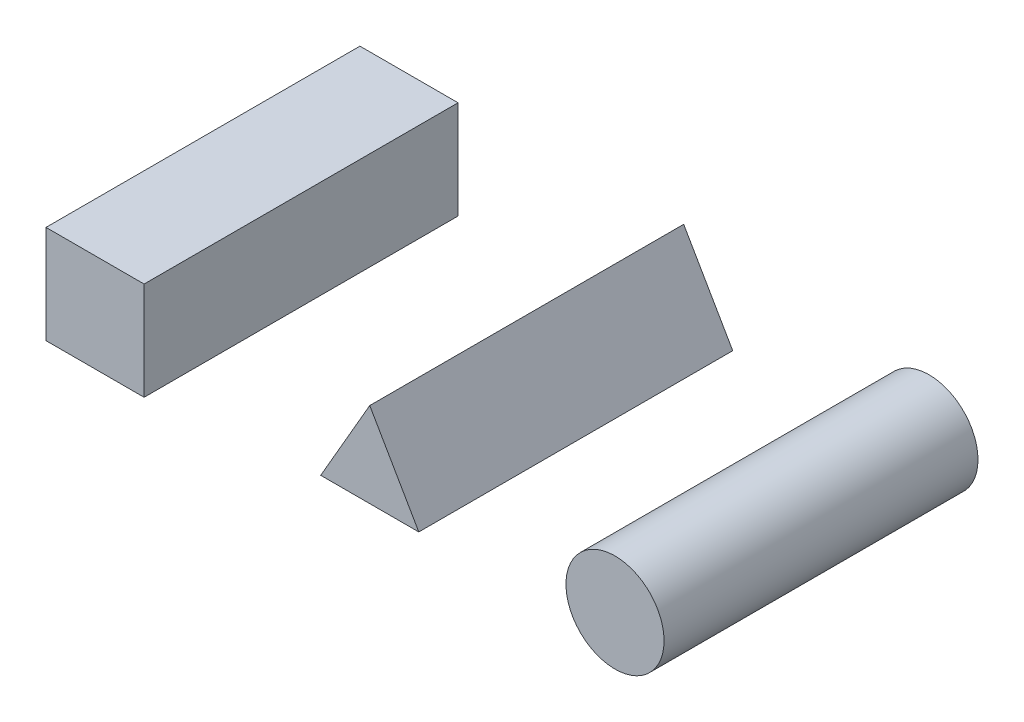
ISO-10303-21;
HEADER;
FILE_DESCRIPTION(('STEP AP214'),'2;1');
FILE_NAME('part.step','',(''),(''),'','','');
FILE_SCHEMA(('AUTOMOTIVE_DESIGN { 1 0 10303 214 1 1 1 1 }'));
ENDSEC;
DATA;
#1=APPLICATION_CONTEXT('core data for automotive mechanical design processes');
#2=APPLICATION_PROTOCOL_DEFINITION('international standard','automotive_design',2000,#1);
#3=PRODUCT_CONTEXT('',#1,'mechanical');
#4=PRODUCT('Part','Part','',(#3));
#5=PRODUCT_RELATED_PRODUCT_CATEGORY('part','',(#4));
#6=PRODUCT_DEFINITION_FORMATION('','',#4);
#7=PRODUCT_DEFINITION_CONTEXT('part definition',#1,'design');
#8=PRODUCT_DEFINITION('design','',#6,#7);
#9=PRODUCT_DEFINITION_SHAPE('','',#8);
#10=(LENGTH_UNIT() NAMED_UNIT(*) SI_UNIT(.MILLI.,.METRE.));
#11=(NAMED_UNIT(*) PLANE_ANGLE_UNIT() SI_UNIT($,.RADIAN.));
#12=(NAMED_UNIT(*) SI_UNIT($,.STERADIAN.) SOLID_ANGLE_UNIT());
#13=UNCERTAINTY_MEASURE_WITH_UNIT(LENGTH_MEASURE(1.E-05),#10,'distance_accuracy_value','');
#14=(GEOMETRIC_REPRESENTATION_CONTEXT(3) GLOBAL_UNCERTAINTY_ASSIGNED_CONTEXT((#13)) GLOBAL_UNIT_ASSIGNED_CONTEXT((#10,
#11,#12)) REPRESENTATION_CONTEXT('',''));
#15=CARTESIAN_POINT('',(0.,0.,0.));
#16=DIRECTION('',(0.,0.,1.));
#17=DIRECTION('',(1.,0.,0.));
#18=AXIS2_PLACEMENT_3D('',#15,#16,#17);
#19=CARTESIAN_POINT('',(62.5,-1.72152649380189E-13,80.));
#20=DIRECTION('',(0.,0.,-1.));
#21=DIRECTION('',(-1.,0.,0.));
#22=AXIS2_PLACEMENT_3D('',#19,#20,#21);
#23=CYLINDRICAL_SURFACE('',#22,12.5);
#24=CARTESIAN_POINT('',(62.5,-1.72152649380189E-13,80.));
#25=DIRECTION('',(0.,0.,1.));
#26=DIRECTION('',(1.,0.,0.));
#27=AXIS2_PLACEMENT_3D('',#24,#25,#26);
#28=CIRCLE('',#27,12.5);
#29=CARTESIAN_POINT('',(75.,-1.72152649380189E-13,80.));
#30=VERTEX_POINT('',#29);
#31=EDGE_CURVE('E11',#30,#30,#28,.T.);
#32=ORIENTED_EDGE('',*,*,#31,.F.);
#33=EDGE_LOOP('',(#32));
#34=FACE_BOUND('',#33,.T.);
#35=CARTESIAN_POINT('',(62.5,-1.72152649380189E-13,0.));
#36=DIRECTION('',(0.,0.,1.));
#37=DIRECTION('',(1.,0.,0.));
#38=AXIS2_PLACEMENT_3D('',#35,#36,#37);
#39=CIRCLE('',#38,12.5);
#40=CARTESIAN_POINT('',(75.,-1.72152649380189E-13,0.));
#41=VERTEX_POINT('',#40);
#42=EDGE_CURVE('E53',#41,#41,#39,.T.);
#43=ORIENTED_EDGE('',*,*,#42,.T.);
#44=EDGE_LOOP('',(#43));
#45=FACE_BOUND('',#44,.T.);
#46=ADVANCED_FACE('F50',(#34,#45),#23,.T.);
#47=CARTESIAN_POINT('',(0.,0.,80.));
#48=DIRECTION('',(0.,0.,1.));
#49=DIRECTION('',(1.,0.,0.));
#50=AXIS2_PLACEMENT_3D('',#47,#48,#49);
#51=PLANE('',#50);
#52=ORIENTED_EDGE('',*,*,#31,.T.);
#53=EDGE_LOOP('',(#52));
#54=FACE_BOUND('',#53,.T.);
#55=ADVANCED_FACE('F65',(#54),#51,.T.);
#56=CARTESIAN_POINT('',(0.,0.,0.));
#57=DIRECTION('',(0.,0.,1.));
#58=DIRECTION('',(1.,0.,0.));
#59=AXIS2_PLACEMENT_3D('',#56,#57,#58);
#60=PLANE('',#59);
#61=ORIENTED_EDGE('',*,*,#42,.F.);
#62=EDGE_LOOP('',(#61));
#63=FACE_BOUND('',#62,.T.);
#64=ADVANCED_FACE('F63',(#63),#60,.F.);
#65=CLOSED_SHELL('',(#46,#55,#64));
#66=MANIFOLD_SOLID_BREP('B2',#65);
#67=CARTESIAN_POINT('',(-57.5,0.,80.));
#68=DIRECTION('',(1.,0.,0.));
#69=DIRECTION('',(0.,1.,0.));
#70=AXIS2_PLACEMENT_3D('',#67,#68,#69);
#71=PLANE('',#70);
#72=DIRECTION('',(0.,-1.,0.));
#73=VECTOR('',#72,1.);
#74=CARTESIAN_POINT('',(-57.5,0.,0.));
#75=LINE('',#74,#73);
#76=CARTESIAN_POINT('',(-57.5,12.4999999999998,0.));
#77=VERTEX_POINT('',#76);
#78=CARTESIAN_POINT('',(-57.5,-12.5000000000002,0.));
#79=VERTEX_POINT('',#78);
#80=EDGE_CURVE('E169',#77,#79,#75,.T.);
#81=ORIENTED_EDGE('',*,*,#80,.F.);
#82=DIRECTION('',(0.,0.,-1.));
#83=VECTOR('',#82,1.);
#84=CARTESIAN_POINT('',(-57.5,12.4999999999998,80.));
#85=LINE('',#84,#83);
#86=CARTESIAN_POINT('',(-57.5,12.4999999999998,80.));
#87=VERTEX_POINT('',#86);
#88=EDGE_CURVE('E48',#87,#77,#85,.T.);
#89=ORIENTED_EDGE('',*,*,#88,.F.);
#90=DIRECTION('',(0.,-1.,0.));
#91=VECTOR('',#90,1.);
#92=CARTESIAN_POINT('',(-57.5,0.,80.));
#93=LINE('',#92,#91);
#94=CARTESIAN_POINT('',(-57.5,-12.5000000000002,80.));
#95=VERTEX_POINT('',#94);
#96=EDGE_CURVE('E160',#87,#95,#93,.T.);
#97=ORIENTED_EDGE('',*,*,#96,.T.);
#98=DIRECTION('',(0.,0.,-1.));
#99=VECTOR('',#98,1.);
#100=CARTESIAN_POINT('',(-57.5,-12.5000000000002,80.));
#101=LINE('',#100,#99);
#102=EDGE_CURVE('E139',#95,#79,#101,.T.);
#103=ORIENTED_EDGE('',*,*,#102,.T.);
#104=EDGE_LOOP('',(#81,#89,#97,#103));
#105=FACE_BOUND('',#104,.T.);
#106=ADVANCED_FACE('F100',(#105),#71,.T.);
#107=CARTESIAN_POINT('',(0.,12.4999999999998,80.));
#108=DIRECTION('',(0.,1.,0.));
#109=DIRECTION('',(-1.,0.,0.));
#110=AXIS2_PLACEMENT_3D('',#107,#108,#109);
#111=PLANE('',#110);
#112=DIRECTION('',(1.,0.,0.));
#113=VECTOR('',#112,1.);
#114=CARTESIAN_POINT('',(0.,12.4999999999998,0.));
#115=LINE('',#114,#113);
#116=CARTESIAN_POINT('',(-82.5,12.4999999999997,0.));
#117=VERTEX_POINT('',#116);
#118=EDGE_CURVE('E152',#117,#77,#115,.T.);
#119=ORIENTED_EDGE('',*,*,#118,.F.);
#120=DIRECTION('',(0.,0.,-1.));
#121=VECTOR('',#120,1.);
#122=CARTESIAN_POINT('',(-82.5,12.4999999999997,80.));
#123=LINE('',#122,#121);
#124=CARTESIAN_POINT('',(-82.5,12.4999999999997,80.));
#125=VERTEX_POINT('',#124);
#126=EDGE_CURVE('E109',#125,#117,#123,.T.);
#127=ORIENTED_EDGE('',*,*,#126,.F.);
#128=DIRECTION('',(1.,0.,0.));
#129=VECTOR('',#128,1.);
#130=CARTESIAN_POINT('',(0.,12.4999999999998,80.));
#131=LINE('',#130,#129);
#132=EDGE_CURVE('E150',#125,#87,#131,.T.);
#133=ORIENTED_EDGE('',*,*,#132,.T.);
#134=ORIENTED_EDGE('',*,*,#88,.T.);
#135=EDGE_LOOP('',(#119,#127,#133,#134));
#136=FACE_BOUND('',#135,.T.);
#137=ADVANCED_FACE('F148',(#136),#111,.T.);
#138=CARTESIAN_POINT('',(-82.5,0.,80.));
#139=DIRECTION('',(1.,0.,0.));
#140=DIRECTION('',(0.,1.,0.));
#141=AXIS2_PLACEMENT_3D('',#138,#139,#140);
#142=PLANE('',#141);
#143=DIRECTION('',(0.,-1.,0.));
#144=VECTOR('',#143,1.);
#145=CARTESIAN_POINT('',(-82.5,0.,0.));
#146=LINE('',#145,#144);
#147=CARTESIAN_POINT('',(-82.4999999999999,-12.5000000000003,0.));
#148=VERTEX_POINT('',#147);
#149=EDGE_CURVE('E132',#117,#148,#146,.T.);
#150=ORIENTED_EDGE('',*,*,#149,.T.);
#151=DIRECTION('',(0.,0.,-1.));
#152=VECTOR('',#151,1.);
#153=CARTESIAN_POINT('',(-82.4999999999999,-12.5000000000003,80.));
#154=LINE('',#153,#152);
#155=CARTESIAN_POINT('',(-82.4999999999999,-12.5000000000003,80.));
#156=VERTEX_POINT('',#155);
#157=EDGE_CURVE('E154',#156,#148,#154,.T.);
#158=ORIENTED_EDGE('',*,*,#157,.F.);
#159=DIRECTION('',(0.,-1.,0.));
#160=VECTOR('',#159,1.);
#161=CARTESIAN_POINT('',(-82.5,0.,80.));
#162=LINE('',#161,#160);
#163=EDGE_CURVE('E155',#125,#156,#162,.T.);
#164=ORIENTED_EDGE('',*,*,#163,.F.);
#165=ORIENTED_EDGE('',*,*,#126,.T.);
#166=EDGE_LOOP('',(#150,#158,#164,#165));
#167=FACE_BOUND('',#166,.T.);
#168=ADVANCED_FACE('F156',(#167),#142,.F.);
#169=CARTESIAN_POINT('',(0.,-12.5000000000002,80.));
#170=DIRECTION('',(0.,1.,0.));
#171=DIRECTION('',(-1.,0.,0.));
#172=AXIS2_PLACEMENT_3D('',#169,#170,#171);
#173=PLANE('',#172);
#174=DIRECTION('',(1.,0.,0.));
#175=VECTOR('',#174,1.);
#176=CARTESIAN_POINT('',(0.,-12.5000000000002,0.));
#177=LINE('',#176,#175);
#178=EDGE_CURVE('E164',#148,#79,#177,.T.);
#179=ORIENTED_EDGE('',*,*,#178,.T.);
#180=ORIENTED_EDGE('',*,*,#102,.F.);
#181=DIRECTION('',(1.,0.,0.));
#182=VECTOR('',#181,1.);
#183=CARTESIAN_POINT('',(0.,-12.5000000000002,80.));
#184=LINE('',#183,#182);
#185=EDGE_CURVE('E117',#156,#95,#184,.T.);
#186=ORIENTED_EDGE('',*,*,#185,.F.);
#187=ORIENTED_EDGE('',*,*,#157,.T.);
#188=EDGE_LOOP('',(#179,#180,#186,#187));
#189=FACE_BOUND('',#188,.T.);
#190=ADVANCED_FACE('F184',(#189),#173,.F.);
#191=CARTESIAN_POINT('',(0.,0.,80.));
#192=DIRECTION('',(0.,0.,1.));
#193=DIRECTION('',(1.,0.,0.));
#194=AXIS2_PLACEMENT_3D('',#191,#192,#193);
#195=PLANE('',#194);
#196=ORIENTED_EDGE('',*,*,#96,.F.);
#197=ORIENTED_EDGE('',*,*,#132,.F.);
#198=ORIENTED_EDGE('',*,*,#163,.T.);
#199=ORIENTED_EDGE('',*,*,#185,.T.);
#200=EDGE_LOOP('',(#196,#197,#198,#199));
#201=FACE_BOUND('',#200,.T.);
#202=ADVANCED_FACE('F159',(#201),#195,.T.);
#203=CARTESIAN_POINT('',(0.,0.,0.));
#204=DIRECTION('',(0.,0.,1.));
#205=DIRECTION('',(1.,0.,0.));
#206=AXIS2_PLACEMENT_3D('',#203,#204,#205);
#207=PLANE('',#206);
#208=ORIENTED_EDGE('',*,*,#80,.T.);
#209=ORIENTED_EDGE('',*,*,#178,.F.);
#210=ORIENTED_EDGE('',*,*,#149,.F.);
#211=ORIENTED_EDGE('',*,*,#118,.T.);
#212=EDGE_LOOP('',(#208,#209,#210,#211));
#213=FACE_BOUND('',#212,.T.);
#214=ADVANCED_FACE('F186',(#213),#207,.F.);
#215=CLOSED_SHELL('',(#106,#137,#168,#190,#202,#214));
#216=MANIFOLD_SOLID_BREP('B6',#215);
#217=CARTESIAN_POINT('',(0.,-7.21687836487053,80.));
#218=DIRECTION('',(0.,-1.,0.));
#219=DIRECTION('',(1.,0.,0.));
#220=AXIS2_PLACEMENT_3D('',#217,#218,#219);
#221=PLANE('',#220);
#222=DIRECTION('',(-1.,0.,0.));
#223=VECTOR('',#222,1.);
#224=CARTESIAN_POINT('',(0.,-7.21687836487053,0.));
#225=LINE('',#224,#223);
#226=CARTESIAN_POINT('',(12.5,-7.21687836487053,0.));
#227=VERTEX_POINT('',#226);
#228=CARTESIAN_POINT('',(-12.5,-7.21687836487054,0.));
#229=VERTEX_POINT('',#228);
#230=EDGE_CURVE('E270',#227,#229,#225,.T.);
#231=ORIENTED_EDGE('',*,*,#230,.F.);
#232=DIRECTION('',(0.,0.,-1.));
#233=VECTOR('',#232,1.);
#234=CARTESIAN_POINT('',(12.5,-7.21687836487053,80.));
#235=LINE('',#234,#233);
#236=CARTESIAN_POINT('',(12.5,-7.21687836487053,80.));
#237=VERTEX_POINT('',#236);
#238=EDGE_CURVE('E98',#237,#227,#235,.T.);
#239=ORIENTED_EDGE('',*,*,#238,.F.);
#240=DIRECTION('',(-1.,0.,0.));
#241=VECTOR('',#240,1.);
#242=CARTESIAN_POINT('',(0.,-7.21687836487053,80.));
#243=LINE('',#242,#241);
#244=CARTESIAN_POINT('',(-12.5,-7.21687836487054,80.));
#245=VERTEX_POINT('',#244);
#246=EDGE_CURVE('E268',#237,#245,#243,.T.);
#247=ORIENTED_EDGE('',*,*,#246,.T.);
#248=DIRECTION('',(0.,0.,-1.));
#249=VECTOR('',#248,1.);
#250=CARTESIAN_POINT('',(-12.5,-7.21687836487054,80.));
#251=LINE('',#250,#249);
#252=EDGE_CURVE('E252',#245,#229,#251,.T.);
#253=ORIENTED_EDGE('',*,*,#252,.T.);
#254=EDGE_LOOP('',(#231,#239,#247,#253));
#255=FACE_BOUND('',#254,.T.);
#256=ADVANCED_FACE('F236',(#255),#221,.T.);
#257=CARTESIAN_POINT('',(6.2499999999999,3.60843918243511,80.));
#258=DIRECTION('',(0.866025403784438,0.5,0.));
#259=DIRECTION('',(-0.5,0.866025403784439,0.));
#260=AXIS2_PLACEMENT_3D('',#257,#258,#259);
#261=PLANE('',#260);
#262=DIRECTION('',(0.5,-0.866025403784439,0.));
#263=VECTOR('',#262,1.);
#264=CARTESIAN_POINT('',(6.2499999999999,3.60843918243511,0.));
#265=LINE('',#264,#263);
#266=CARTESIAN_POINT('',(0.,14.4337567297404,0.));
#267=VERTEX_POINT('',#266);
#268=EDGE_CURVE('E286',#267,#227,#265,.T.);
#269=ORIENTED_EDGE('',*,*,#268,.F.);
#270=DIRECTION('',(0.,0.,-1.));
#271=VECTOR('',#270,1.);
#272=CARTESIAN_POINT('',(0.,14.4337567297404,80.));
#273=LINE('',#272,#271);
#274=CARTESIAN_POINT('',(0.,14.4337567297404,80.));
#275=VERTEX_POINT('',#274);
#276=EDGE_CURVE('E244',#275,#267,#273,.T.);
#277=ORIENTED_EDGE('',*,*,#276,.F.);
#278=DIRECTION('',(0.5,-0.866025403784439,0.));
#279=VECTOR('',#278,1.);
#280=CARTESIAN_POINT('',(6.2499999999999,3.60843918243511,80.));
#281=LINE('',#280,#279);
#282=EDGE_CURVE('E277',#275,#237,#281,.T.);
#283=ORIENTED_EDGE('',*,*,#282,.T.);
#284=ORIENTED_EDGE('',*,*,#238,.T.);
#285=EDGE_LOOP('',(#269,#277,#283,#284));
#286=FACE_BOUND('',#285,.T.);
#287=ADVANCED_FACE('F281',(#286),#261,.T.);
#288=CARTESIAN_POINT('',(-6.24999999999991,3.60843918243511,80.));
#289=DIRECTION('',(-0.866025403784439,0.5,0.));
#290=DIRECTION('',(-0.5,-0.866025403784439,0.));
#291=AXIS2_PLACEMENT_3D('',#288,#289,#290);
#292=PLANE('',#291);
#293=DIRECTION('',(0.5,0.866025403784439,0.));
#294=VECTOR('',#293,1.);
#295=CARTESIAN_POINT('',(-6.24999999999991,3.60843918243511,0.));
#296=LINE('',#295,#294);
#297=EDGE_CURVE('E279',#229,#267,#296,.T.);
#298=ORIENTED_EDGE('',*,*,#297,.F.);
#299=ORIENTED_EDGE('',*,*,#252,.F.);
#300=DIRECTION('',(0.5,0.866025403784439,0.));
#301=VECTOR('',#300,1.);
#302=CARTESIAN_POINT('',(-6.24999999999991,3.60843918243511,80.));
#303=LINE('',#302,#301);
#304=EDGE_CURVE('E278',#245,#275,#303,.T.);
#305=ORIENTED_EDGE('',*,*,#304,.T.);
#306=ORIENTED_EDGE('',*,*,#276,.T.);
#307=EDGE_LOOP('',(#298,#299,#305,#306));
#308=FACE_BOUND('',#307,.T.);
#309=ADVANCED_FACE('F292',(#308),#292,.T.);
#310=CARTESIAN_POINT('',(0.,0.,80.));
#311=DIRECTION('',(0.,0.,1.));
#312=DIRECTION('',(1.,0.,0.));
#313=AXIS2_PLACEMENT_3D('',#310,#311,#312);
#314=PLANE('',#313);
#315=ORIENTED_EDGE('',*,*,#246,.F.);
#316=ORIENTED_EDGE('',*,*,#282,.F.);
#317=ORIENTED_EDGE('',*,*,#304,.F.);
#318=EDGE_LOOP('',(#315,#316,#317));
#319=FACE_BOUND('',#318,.T.);
#320=ADVANCED_FACE('F276',(#319),#314,.T.);
#321=CARTESIAN_POINT('',(0.,0.,0.));
#322=DIRECTION('',(0.,0.,1.));
#323=DIRECTION('',(1.,0.,0.));
#324=AXIS2_PLACEMENT_3D('',#321,#322,#323);
#325=PLANE('',#324);
#326=ORIENTED_EDGE('',*,*,#230,.T.);
#327=ORIENTED_EDGE('',*,*,#297,.T.);
#328=ORIENTED_EDGE('',*,*,#268,.T.);
#329=EDGE_LOOP('',(#326,#327,#328));
#330=FACE_BOUND('',#329,.T.);
#331=ADVANCED_FACE('F291',(#330),#325,.F.);
#332=CLOSED_SHELL('',(#256,#287,#309,#320,#331));
#333=MANIFOLD_SOLID_BREP('B42',#332);
#334=ADVANCED_BREP_SHAPE_REPRESENTATION('',(#18,#66,#216,#333),#14);
#335=SHAPE_DEFINITION_REPRESENTATION(#9,#334);
ENDSEC;
END-ISO-10303-21;
